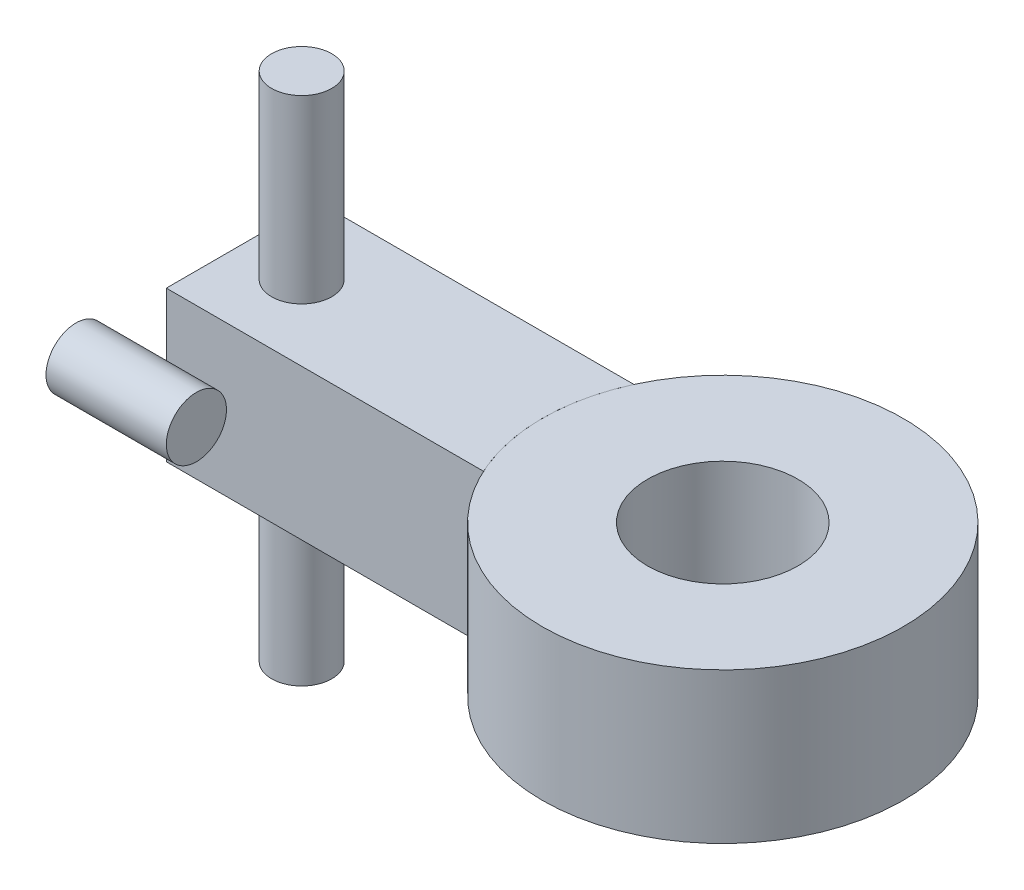
ISO-10303-21;
HEADER;
FILE_DESCRIPTION(('STEP AP214'),'2;1');
FILE_NAME('part.step','',(''),(''),'','','');
FILE_SCHEMA(('AUTOMOTIVE_DESIGN { 1 0 10303 214 1 1 1 1 }'));
ENDSEC;
DATA;
#1=APPLICATION_CONTEXT('core data for automotive mechanical design processes');
#2=APPLICATION_PROTOCOL_DEFINITION('international standard','automotive_design',2000,#1);
#3=PRODUCT_CONTEXT('',#1,'mechanical');
#4=PRODUCT('Part','Part','',(#3));
#5=PRODUCT_RELATED_PRODUCT_CATEGORY('part','',(#4));
#6=PRODUCT_DEFINITION_FORMATION('','',#4);
#7=PRODUCT_DEFINITION_CONTEXT('part definition',#1,'design');
#8=PRODUCT_DEFINITION('design','',#6,#7);
#9=PRODUCT_DEFINITION_SHAPE('','',#8);
#10=(LENGTH_UNIT() NAMED_UNIT(*) SI_UNIT(.MILLI.,.METRE.));
#11=(NAMED_UNIT(*) PLANE_ANGLE_UNIT() SI_UNIT($,.RADIAN.));
#12=(NAMED_UNIT(*) SI_UNIT($,.STERADIAN.) SOLID_ANGLE_UNIT());
#13=UNCERTAINTY_MEASURE_WITH_UNIT(LENGTH_MEASURE(1.E-05),#10,'distance_accuracy_value','');
#14=(GEOMETRIC_REPRESENTATION_CONTEXT(3) GLOBAL_UNCERTAINTY_ASSIGNED_CONTEXT((#13)) GLOBAL_UNIT_ASSIGNED_CONTEXT((#10,
#11,#12)) REPRESENTATION_CONTEXT('',''));
#15=CARTESIAN_POINT('',(0.,0.,0.));
#16=DIRECTION('',(0.,0.,1.));
#17=DIRECTION('',(1.,0.,0.));
#18=AXIS2_PLACEMENT_3D('',#15,#16,#17);
#19=CARTESIAN_POINT('',(-70.,12.5,17.5));
#20=DIRECTION('',(-1.,0.,0.));
#21=DIRECTION('',(0.,0.,1.));
#22=AXIS2_PLACEMENT_3D('',#19,#20,#21);
#23=CYLINDRICAL_SURFACE('',#22,5.);
#24=CARTESIAN_POINT('',(-70.,12.5,17.5));
#25=DIRECTION('',(-1.,0.,0.));
#26=DIRECTION('',(0.,0.,1.));
#27=AXIS2_PLACEMENT_3D('',#24,#25,#26);
#28=CIRCLE('',#27,5.);
#29=CARTESIAN_POINT('',(-70.,12.5,22.5));
#30=VERTEX_POINT('',#29);
#31=EDGE_CURVE('E11',#30,#30,#28,.T.);
#32=ORIENTED_EDGE('',*,*,#31,.T.);
#33=EDGE_LOOP('',(#32));
#34=FACE_BOUND('',#33,.T.);
#35=CARTESIAN_POINT('',(-90.,12.5,17.5));
#36=DIRECTION('',(-1.,0.,0.));
#37=DIRECTION('',(0.,0.,1.));
#38=AXIS2_PLACEMENT_3D('',#35,#36,#37);
#39=CIRCLE('',#38,5.);
#40=CARTESIAN_POINT('',(-90.,12.5,22.5));
#41=VERTEX_POINT('',#40);
#42=EDGE_CURVE('E50',#41,#41,#39,.T.);
#43=ORIENTED_EDGE('',*,*,#42,.F.);
#44=EDGE_LOOP('',(#43));
#45=FACE_BOUND('',#44,.T.);
#46=ADVANCED_FACE('F44',(#34,#45),#23,.T.);
#47=CARTESIAN_POINT('',(-70.,12.5,17.5));
#48=DIRECTION('',(-1.,0.,0.));
#49=DIRECTION('',(0.,0.,1.));
#50=AXIS2_PLACEMENT_3D('',#47,#48,#49);
#51=PLANE('',#50);
#52=ORIENTED_EDGE('',*,*,#31,.F.);
#53=EDGE_LOOP('',(#52));
#54=FACE_BOUND('',#53,.T.);
#55=ADVANCED_FACE('F59',(#54),#51,.F.);
#56=CARTESIAN_POINT('',(-90.,12.5,17.5));
#57=DIRECTION('',(-1.,0.,0.));
#58=DIRECTION('',(0.,0.,1.));
#59=AXIS2_PLACEMENT_3D('',#56,#57,#58);
#60=PLANE('',#59);
#61=ORIENTED_EDGE('',*,*,#42,.T.);
#62=EDGE_LOOP('',(#61));
#63=FACE_BOUND('',#62,.T.);
#64=ADVANCED_FACE('F56',(#63),#60,.T.);
#65=CLOSED_SHELL('',(#46,#55,#64));
#66=MANIFOLD_SOLID_BREP('B2',#65);
#67=CARTESIAN_POINT('',(-80.,0.,-12.5));
#68=DIRECTION('',(0.,0.,-1.));
#69=DIRECTION('',(-1.,0.,0.));
#70=AXIS2_PLACEMENT_3D('',#67,#68,#69);
#71=PLANE('',#70);
#72=DIRECTION('',(1.,0.,0.));
#73=VECTOR('',#72,1.);
#74=CARTESIAN_POINT('',(-80.,25.,-12.5));
#75=LINE('',#74,#73);
#76=CARTESIAN_POINT('',(-80.,25.,-12.5));
#77=VERTEX_POINT('',#76);
#78=CARTESIAN_POINT('',(-27.2717802865893,25.,-12.5));
#79=VERTEX_POINT('',#78);
#80=EDGE_CURVE('E105',#77,#79,#75,.T.);
#81=ORIENTED_EDGE('',*,*,#80,.T.);
#82=DIRECTION('',(0.,-1.,0.));
#83=VECTOR('',#82,1.);
#84=CARTESIAN_POINT('',(-27.2717802865893,25.,-12.5));
#85=LINE('',#84,#83);
#86=CARTESIAN_POINT('',(-27.2717802865893,0.,-12.5));
#87=VERTEX_POINT('',#86);
#88=EDGE_CURVE('E147',#87,#79,#85,.F.);
#89=ORIENTED_EDGE('',*,*,#88,.F.);
#90=DIRECTION('',(1.,0.,0.));
#91=VECTOR('',#90,1.);
#92=CARTESIAN_POINT('',(-80.,0.,-12.5));
#93=LINE('',#92,#91);
#94=CARTESIAN_POINT('',(-80.,0.,-12.5));
#95=VERTEX_POINT('',#94);
#96=EDGE_CURVE('E98',#95,#87,#93,.T.);
#97=ORIENTED_EDGE('',*,*,#96,.F.);
#98=DIRECTION('',(0.,1.,0.));
#99=VECTOR('',#98,1.);
#100=CARTESIAN_POINT('',(-80.,0.,-12.5));
#101=LINE('',#100,#99);
#102=EDGE_CURVE('E161',#95,#77,#101,.T.);
#103=ORIENTED_EDGE('',*,*,#102,.T.);
#104=EDGE_LOOP('',(#81,#89,#97,#103));
#105=FACE_BOUND('',#104,.T.);
#106=ADVANCED_FACE('F91',(#105),#71,.T.);
#107=CARTESIAN_POINT('',(-80.,0.,0.));
#108=DIRECTION('',(0.,1.,0.));
#109=DIRECTION('',(0.,0.,1.));
#110=AXIS2_PLACEMENT_3D('',#107,#108,#109);
#111=PLANE('',#110);
#112=CARTESIAN_POINT('',(-70.,0.,0.));
#113=DIRECTION('',(0.,1.,0.));
#114=DIRECTION('',(0.,0.,1.));
#115=AXIS2_PLACEMENT_3D('',#112,#113,#114);
#116=CIRCLE('',#115,5.);
#117=CARTESIAN_POINT('',(-70.,0.,5.));
#118=VERTEX_POINT('',#117);
#119=EDGE_CURVE('E151',#118,#118,#116,.T.);
#120=ORIENTED_EDGE('',*,*,#119,.T.);
#121=EDGE_LOOP('',(#120));
#122=FACE_BOUND('',#121,.T.);
#123=ORIENTED_EDGE('',*,*,#96,.T.);
#124=CARTESIAN_POINT('',(0.,0.,0.));
#125=DIRECTION('',(0.,-1.,0.));
#126=DIRECTION('',(0.,0.,-1.));
#127=AXIS2_PLACEMENT_3D('',#124,#125,#126);
#128=CIRCLE('',#127,30.);
#129=CARTESIAN_POINT('',(-27.2717802865893,0.,12.5));
#130=VERTEX_POINT('',#129);
#131=EDGE_CURVE('E136',#87,#130,#128,.F.);
#132=ORIENTED_EDGE('',*,*,#131,.T.);
#133=DIRECTION('',(1.,0.,0.));
#134=VECTOR('',#133,1.);
#135=CARTESIAN_POINT('',(-80.,0.,12.5));
#136=LINE('',#135,#134);
#137=CARTESIAN_POINT('',(-80.,0.,12.5));
#138=VERTEX_POINT('',#137);
#139=EDGE_CURVE('E141',#138,#130,#136,.T.);
#140=ORIENTED_EDGE('',*,*,#139,.F.);
#141=DIRECTION('',(0.,0.,1.));
#142=VECTOR('',#141,1.);
#143=CARTESIAN_POINT('',(-80.,0.,0.));
#144=LINE('',#143,#142);
#145=EDGE_CURVE('E137',#95,#138,#144,.T.);
#146=ORIENTED_EDGE('',*,*,#145,.F.);
#147=EDGE_LOOP('',(#123,#132,#140,#146));
#148=FACE_BOUND('',#147,.T.);
#149=ADVANCED_FACE('F134',(#122,#148),#111,.F.);
#150=CARTESIAN_POINT('',(-80.,0.,12.5));
#151=DIRECTION('',(0.,0.,-1.));
#152=DIRECTION('',(-1.,0.,0.));
#153=AXIS2_PLACEMENT_3D('',#150,#151,#152);
#154=PLANE('',#153);
#155=ORIENTED_EDGE('',*,*,#139,.T.);
#156=DIRECTION('',(0.,-1.,0.));
#157=VECTOR('',#156,1.);
#158=CARTESIAN_POINT('',(-27.2717802865893,25.,12.5));
#159=LINE('',#158,#157);
#160=CARTESIAN_POINT('',(-27.2717802865893,25.,12.5));
#161=VERTEX_POINT('',#160);
#162=EDGE_CURVE('E149',#130,#161,#159,.F.);
#163=ORIENTED_EDGE('',*,*,#162,.T.);
#164=DIRECTION('',(1.,0.,0.));
#165=VECTOR('',#164,1.);
#166=CARTESIAN_POINT('',(-80.,25.,12.5));
#167=LINE('',#166,#165);
#168=CARTESIAN_POINT('',(-80.,25.,12.5));
#169=VERTEX_POINT('',#168);
#170=EDGE_CURVE('E168',#169,#161,#167,.T.);
#171=ORIENTED_EDGE('',*,*,#170,.F.);
#172=DIRECTION('',(0.,1.,0.));
#173=VECTOR('',#172,1.);
#174=CARTESIAN_POINT('',(-80.,0.,12.5));
#175=LINE('',#174,#173);
#176=EDGE_CURVE('E113',#138,#169,#175,.T.);
#177=ORIENTED_EDGE('',*,*,#176,.F.);
#178=EDGE_LOOP('',(#155,#163,#171,#177));
#179=FACE_BOUND('',#178,.T.);
#180=ADVANCED_FACE('F171',(#179),#154,.F.);
#181=CARTESIAN_POINT('',(-80.,25.,0.));
#182=DIRECTION('',(0.,1.,0.));
#183=DIRECTION('',(0.,0.,1.));
#184=AXIS2_PLACEMENT_3D('',#181,#182,#183);
#185=PLANE('',#184);
#186=CARTESIAN_POINT('',(-70.,25.,0.));
#187=DIRECTION('',(0.,1.,0.));
#188=DIRECTION('',(0.,0.,1.));
#189=AXIS2_PLACEMENT_3D('',#186,#187,#188);
#190=CIRCLE('',#189,5.);
#191=CARTESIAN_POINT('',(-70.,25.,5.));
#192=VERTEX_POINT('',#191);
#193=EDGE_CURVE('E42',#192,#192,#190,.T.);
#194=ORIENTED_EDGE('',*,*,#193,.F.);
#195=EDGE_LOOP('',(#194));
#196=FACE_BOUND('',#195,.T.);
#197=CARTESIAN_POINT('',(0.,25.,0.));
#198=DIRECTION('',(0.,-1.,0.));
#199=DIRECTION('',(0.,0.,-1.));
#200=AXIS2_PLACEMENT_3D('',#197,#198,#199);
#201=CIRCLE('',#200,30.);
#202=EDGE_CURVE('E158',#79,#161,#201,.F.);
#203=ORIENTED_EDGE('',*,*,#202,.F.);
#204=ORIENTED_EDGE('',*,*,#80,.F.);
#205=DIRECTION('',(0.,0.,1.));
#206=VECTOR('',#205,1.);
#207=CARTESIAN_POINT('',(-80.,25.,0.));
#208=LINE('',#207,#206);
#209=EDGE_CURVE('E165',#77,#169,#208,.T.);
#210=ORIENTED_EDGE('',*,*,#209,.T.);
#211=ORIENTED_EDGE('',*,*,#170,.T.);
#212=EDGE_LOOP('',(#203,#204,#210,#211));
#213=FACE_BOUND('',#212,.T.);
#214=ADVANCED_FACE('F172',(#196,#213),#185,.T.);
#215=CARTESIAN_POINT('',(-80.,0.,0.));
#216=DIRECTION('',(-1.,0.,0.));
#217=DIRECTION('',(0.,0.,1.));
#218=AXIS2_PLACEMENT_3D('',#215,#216,#217);
#219=PLANE('',#218);
#220=ORIENTED_EDGE('',*,*,#102,.F.);
#221=ORIENTED_EDGE('',*,*,#145,.T.);
#222=ORIENTED_EDGE('',*,*,#176,.T.);
#223=ORIENTED_EDGE('',*,*,#209,.F.);
#224=EDGE_LOOP('',(#220,#221,#222,#223));
#225=FACE_BOUND('',#224,.T.);
#226=ADVANCED_FACE('F173',(#225),#219,.T.);
#227=CARTESIAN_POINT('',(0.,25.,0.));
#228=DIRECTION('',(0.,-1.,0.));
#229=DIRECTION('',(0.,0.,-1.));
#230=AXIS2_PLACEMENT_3D('',#227,#228,#229);
#231=CYLINDRICAL_SURFACE('',#230,30.);
#232=ORIENTED_EDGE('',*,*,#131,.F.);
#233=ORIENTED_EDGE('',*,*,#88,.T.);
#234=ORIENTED_EDGE('',*,*,#202,.T.);
#235=ORIENTED_EDGE('',*,*,#162,.F.);
#236=EDGE_LOOP('',(#232,#233,#234,#235));
#237=FACE_BOUND('',#236,.T.);
#238=ADVANCED_FACE('F145',(#237),#231,.F.);
#239=CARTESIAN_POINT('',(-70.,55.,0.));
#240=DIRECTION('',(0.,-1.,0.));
#241=DIRECTION('',(0.,0.,-1.));
#242=AXIS2_PLACEMENT_3D('',#239,#240,#241);
#243=PLANE('',#242);
#244=CARTESIAN_POINT('',(-70.,55.,0.));
#245=DIRECTION('',(0.,-1.,0.));
#246=DIRECTION('',(0.,0.,-1.));
#247=AXIS2_PLACEMENT_3D('',#244,#245,#246);
#248=CIRCLE('',#247,5.);
#249=CARTESIAN_POINT('',(-70.,55.,-5.));
#250=VERTEX_POINT('',#249);
#251=EDGE_CURVE('E154',#250,#250,#248,.T.);
#252=ORIENTED_EDGE('',*,*,#251,.F.);
#253=EDGE_LOOP('',(#252));
#254=FACE_BOUND('',#253,.T.);
#255=ADVANCED_FACE('F180',(#254),#243,.F.);
#256=CARTESIAN_POINT('',(-70.,55.,0.));
#257=DIRECTION('',(0.,-1.,0.));
#258=DIRECTION('',(0.,0.,-1.));
#259=AXIS2_PLACEMENT_3D('',#256,#257,#258);
#260=CYLINDRICAL_SURFACE('',#259,5.);
#261=ORIENTED_EDGE('',*,*,#193,.T.);
#262=EDGE_LOOP('',(#261));
#263=FACE_BOUND('',#262,.T.);
#264=ORIENTED_EDGE('',*,*,#251,.T.);
#265=EDGE_LOOP('',(#264));
#266=FACE_BOUND('',#265,.T.);
#267=ADVANCED_FACE('F200',(#263,#266),#260,.T.);
#268=CARTESIAN_POINT('',(-70.,-30.,0.));
#269=DIRECTION('',(0.,-1.,0.));
#270=DIRECTION('',(0.,0.,-1.));
#271=AXIS2_PLACEMENT_3D('',#268,#269,#270);
#272=CIRCLE('',#271,5.);
#273=CARTESIAN_POINT('',(-70.,-30.,-5.));
#274=VERTEX_POINT('',#273);
#275=EDGE_CURVE('E219',#274,#274,#272,.T.);
#276=ORIENTED_EDGE('',*,*,#275,.F.);
#277=EDGE_LOOP('',(#276));
#278=FACE_BOUND('',#277,.T.);
#279=ORIENTED_EDGE('',*,*,#119,.F.);
#280=EDGE_LOOP('',(#279));
#281=FACE_BOUND('',#280,.T.);
#282=ADVANCED_FACE('F197',(#278,#281),#260,.T.);
#283=CARTESIAN_POINT('',(-70.,-30.,0.));
#284=DIRECTION('',(0.,-1.,0.));
#285=DIRECTION('',(0.,0.,-1.));
#286=AXIS2_PLACEMENT_3D('',#283,#284,#285);
#287=PLANE('',#286);
#288=ORIENTED_EDGE('',*,*,#275,.T.);
#289=EDGE_LOOP('',(#288));
#290=FACE_BOUND('',#289,.T.);
#291=ADVANCED_FACE('F199',(#290),#287,.T.);
#292=CLOSED_SHELL('',(#106,#149,#180,#214,#226,#238,#255,#267,#282,#291));
#293=MANIFOLD_SOLID_BREP('B6',#292);
#294=CARTESIAN_POINT('',(0.,25.,0.));
#295=DIRECTION('',(0.,1.,0.));
#296=DIRECTION('',(0.,0.,1.));
#297=AXIS2_PLACEMENT_3D('',#294,#295,#296);
#298=PLANE('',#297);
#299=CARTESIAN_POINT('',(0.,25.,0.));
#300=DIRECTION('',(0.,1.,0.));
#301=DIRECTION('',(0.,0.,1.));
#302=AXIS2_PLACEMENT_3D('',#299,#300,#301);
#303=CIRCLE('',#302,30.);
#304=CARTESIAN_POINT('',(0.,25.,30.));
#305=VERTEX_POINT('',#304);
#306=EDGE_CURVE('E90',#305,#305,#303,.T.);
#307=ORIENTED_EDGE('',*,*,#306,.T.);
#308=EDGE_LOOP('',(#307));
#309=FACE_BOUND('',#308,.T.);
#310=CARTESIAN_POINT('',(0.,25.,0.));
#311=DIRECTION('',(0.,1.,0.));
#312=DIRECTION('',(0.,0.,1.));
#313=AXIS2_PLACEMENT_3D('',#310,#311,#312);
#314=CIRCLE('',#313,12.5);
#315=CARTESIAN_POINT('',(0.,25.,12.5));
#316=VERTEX_POINT('',#315);
#317=EDGE_CURVE('E287',#316,#316,#314,.T.);
#318=ORIENTED_EDGE('',*,*,#317,.F.);
#319=EDGE_LOOP('',(#318));
#320=FACE_BOUND('',#319,.T.);
#321=ADVANCED_FACE('F276',(#309,#320),#298,.T.);
#322=CARTESIAN_POINT('',(0.,0.,0.));
#323=DIRECTION('',(0.,1.,0.));
#324=DIRECTION('',(0.,0.,1.));
#325=AXIS2_PLACEMENT_3D('',#322,#323,#324);
#326=PLANE('',#325);
#327=CARTESIAN_POINT('',(0.,0.,0.));
#328=DIRECTION('',(0.,1.,0.));
#329=DIRECTION('',(0.,0.,1.));
#330=AXIS2_PLACEMENT_3D('',#327,#328,#329);
#331=CIRCLE('',#330,30.);
#332=CARTESIAN_POINT('',(0.,0.,30.));
#333=VERTEX_POINT('',#332);
#334=EDGE_CURVE('E280',#333,#333,#331,.T.);
#335=ORIENTED_EDGE('',*,*,#334,.F.);
#336=EDGE_LOOP('',(#335));
#337=FACE_BOUND('',#336,.T.);
#338=CARTESIAN_POINT('',(0.,0.,0.));
#339=DIRECTION('',(0.,1.,0.));
#340=DIRECTION('',(0.,0.,1.));
#341=AXIS2_PLACEMENT_3D('',#338,#339,#340);
#342=CIRCLE('',#341,12.5);
#343=CARTESIAN_POINT('',(0.,0.,12.5));
#344=VERTEX_POINT('',#343);
#345=EDGE_CURVE('E289',#344,#344,#342,.T.);
#346=ORIENTED_EDGE('',*,*,#345,.T.);
#347=EDGE_LOOP('',(#346));
#348=FACE_BOUND('',#347,.T.);
#349=ADVANCED_FACE('F299',(#337,#348),#326,.F.);
#350=CARTESIAN_POINT('',(0.,25.,0.));
#351=DIRECTION('',(0.,-1.,0.));
#352=DIRECTION('',(0.,0.,-1.));
#353=AXIS2_PLACEMENT_3D('',#350,#351,#352);
#354=CYLINDRICAL_SURFACE('',#353,30.);
#355=ORIENTED_EDGE('',*,*,#306,.F.);
#356=EDGE_LOOP('',(#355));
#357=FACE_BOUND('',#356,.T.);
#358=ORIENTED_EDGE('',*,*,#334,.T.);
#359=EDGE_LOOP('',(#358));
#360=FACE_BOUND('',#359,.T.);
#361=ADVANCED_FACE('F278',(#357,#360),#354,.T.);
#362=CARTESIAN_POINT('',(0.,25.,0.));
#363=DIRECTION('',(0.,-1.,0.));
#364=DIRECTION('',(0.,0.,-1.));
#365=AXIS2_PLACEMENT_3D('',#362,#363,#364);
#366=CYLINDRICAL_SURFACE('',#365,12.5);
#367=ORIENTED_EDGE('',*,*,#317,.T.);
#368=EDGE_LOOP('',(#367));
#369=FACE_BOUND('',#368,.T.);
#370=ORIENTED_EDGE('',*,*,#345,.F.);
#371=EDGE_LOOP('',(#370));
#372=FACE_BOUND('',#371,.T.);
#373=ADVANCED_FACE('F295',(#369,#372),#366,.F.);
#374=CLOSED_SHELL('',(#321,#349,#361,#373));
#375=MANIFOLD_SOLID_BREP('B36',#374);
#376=ADVANCED_BREP_SHAPE_REPRESENTATION('',(#18,#66,#293,#375),#14);
#377=SHAPE_DEFINITION_REPRESENTATION(#9,#376);
ENDSEC;
END-ISO-10303-21;
